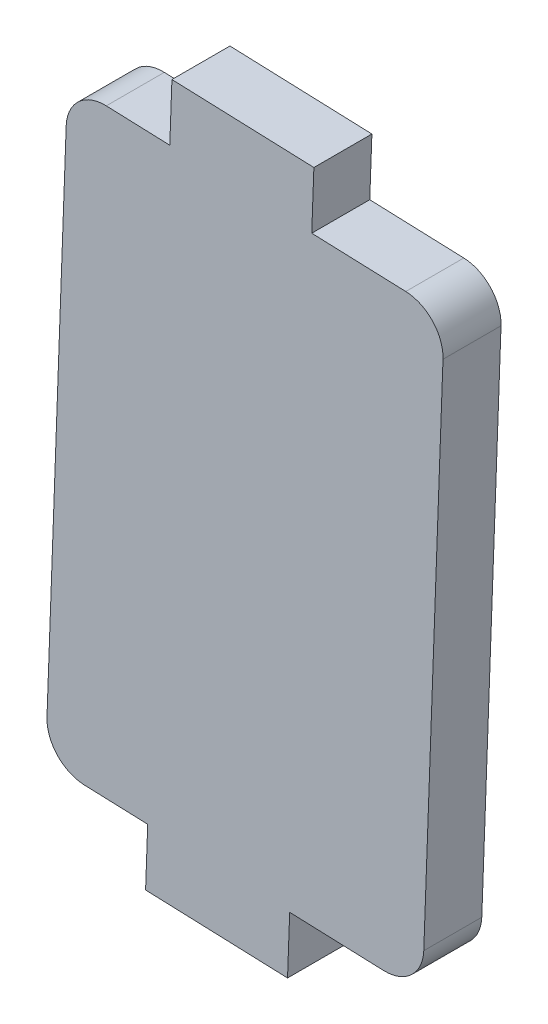
ISO-10303-21;
HEADER;
FILE_DESCRIPTION(('STEP AP214'),'2;1');
FILE_NAME('part.step','',(''),(''),'','','');
FILE_SCHEMA(('AUTOMOTIVE_DESIGN { 1 0 10303 214 1 1 1 1 }'));
ENDSEC;
DATA;
#1=APPLICATION_CONTEXT('core data for automotive mechanical design processes');
#2=APPLICATION_PROTOCOL_DEFINITION('international standard','automotive_design',2000,#1);
#3=PRODUCT_CONTEXT('',#1,'mechanical');
#4=PRODUCT('Part','Part','',(#3));
#5=PRODUCT_RELATED_PRODUCT_CATEGORY('part','',(#4));
#6=PRODUCT_DEFINITION_FORMATION('','',#4);
#7=PRODUCT_DEFINITION_CONTEXT('part definition',#1,'design');
#8=PRODUCT_DEFINITION('design','',#6,#7);
#9=PRODUCT_DEFINITION_SHAPE('','',#8);
#10=(LENGTH_UNIT() NAMED_UNIT(*) SI_UNIT(.MILLI.,.METRE.));
#11=(NAMED_UNIT(*) PLANE_ANGLE_UNIT() SI_UNIT($,.RADIAN.));
#12=(NAMED_UNIT(*) SI_UNIT($,.STERADIAN.) SOLID_ANGLE_UNIT());
#13=UNCERTAINTY_MEASURE_WITH_UNIT(LENGTH_MEASURE(1.E-05),#10,'distance_accuracy_value','');
#14=(GEOMETRIC_REPRESENTATION_CONTEXT(3) GLOBAL_UNCERTAINTY_ASSIGNED_CONTEXT((#13)) GLOBAL_UNIT_ASSIGNED_CONTEXT((#10,
#11,#12)) REPRESENTATION_CONTEXT('',''));
#15=CARTESIAN_POINT('',(0.,0.,0.));
#16=DIRECTION('',(0.,0.,1.));
#17=DIRECTION('',(1.,0.,0.));
#18=AXIS2_PLACEMENT_3D('',#15,#16,#17);
#19=CARTESIAN_POINT('',(708.902436994534,484.37191480293,3.00000000000002));
#20=DIRECTION('',(0.0368075614884528,0.999322372118865,0.));
#21=DIRECTION('',(-0.999322372118865,0.0368075614884533,0.));
#22=AXIS2_PLACEMENT_3D('',#19,#20,#21);
#23=PLANE('',#22);
#24=DIRECTION('',(0.999322372118865,-0.0368075614884534,0.));
#25=VECTOR('',#24,1.);
#26=CARTESIAN_POINT('',(708.902436994534,484.37191480293,0.));
#27=LINE('',#26,#25);
#28=CARTESIAN_POINT('',(701.562436994534,484.642265501426,0.));
#29=VERTEX_POINT('',#28);
#30=CARTESIAN_POINT('',(708.902436994534,484.37191480293,0.));
#31=VERTEX_POINT('',#30);
#32=EDGE_CURVE('E148',#29,#31,#27,.T.);
#33=ORIENTED_EDGE('',*,*,#32,.T.);
#34=DIRECTION('',(0.,0.,-1.));
#35=VECTOR('',#34,1.);
#36=CARTESIAN_POINT('',(708.902436994534,484.37191480293,3.00000000000002));
#37=LINE('',#36,#35);
#38=CARTESIAN_POINT('',(708.902436994534,484.37191480293,3.00000000000002));
#39=VERTEX_POINT('',#38);
#40=EDGE_CURVE('E11',#39,#31,#37,.T.);
#41=ORIENTED_EDGE('',*,*,#40,.F.);
#42=DIRECTION('',(0.999322372118865,-0.0368075614884534,0.));
#43=VECTOR('',#42,1.);
#44=CARTESIAN_POINT('',(708.902436994534,484.37191480293,3.00000000000002));
#45=LINE('',#44,#43);
#46=CARTESIAN_POINT('',(701.562436994534,484.642265501426,3.));
#47=VERTEX_POINT('',#46);
#48=EDGE_CURVE('E191',#47,#39,#45,.T.);
#49=ORIENTED_EDGE('',*,*,#48,.F.);
#50=DIRECTION('',(0.,0.,-1.));
#51=VECTOR('',#50,1.);
#52=CARTESIAN_POINT('',(701.562436994534,484.642265501426,3.));
#53=LINE('',#52,#51);
#54=EDGE_CURVE('E161',#47,#29,#53,.T.);
#55=ORIENTED_EDGE('',*,*,#54,.T.);
#56=EDGE_LOOP('',(#33,#41,#49,#55));
#57=FACE_BOUND('',#56,.T.);
#58=ADVANCED_FACE('F32',(#57),#23,.F.);
#59=CARTESIAN_POINT('',(708.902436994534,484.37191480293,3.00000000000002));
#60=DIRECTION('',(-0.999322372118865,0.0368075614884591,0.));
#61=DIRECTION('',(-0.0368075614884588,-0.999322372118864,0.));
#62=AXIS2_PLACEMENT_3D('',#59,#60,#61);
#63=PLANE('',#62);
#64=DIRECTION('',(0.0368075614884587,0.999322372118864,0.));
#65=VECTOR('',#64,1.);
#66=CARTESIAN_POINT('',(708.902436994534,484.37191480293,0.));
#67=LINE('',#66,#65);
#68=CARTESIAN_POINT('',(709.012859679,487.369881919287,0.));
#69=VERTEX_POINT('',#68);
#70=EDGE_CURVE('E144',#31,#69,#67,.T.);
#71=ORIENTED_EDGE('',*,*,#70,.T.);
#72=DIRECTION('',(0.,0.,-1.));
#73=VECTOR('',#72,1.);
#74=CARTESIAN_POINT('',(709.012859679,487.369881919287,3.00000000000004));
#75=LINE('',#74,#73);
#76=CARTESIAN_POINT('',(709.012859679,487.369881919287,3.00000000000004));
#77=VERTEX_POINT('',#76);
#78=EDGE_CURVE('E39',#77,#69,#75,.T.);
#79=ORIENTED_EDGE('',*,*,#78,.F.);
#80=DIRECTION('',(0.0368075614884587,0.999322372118864,0.));
#81=VECTOR('',#80,1.);
#82=CARTESIAN_POINT('',(708.902436994534,484.37191480293,3.00000000000002));
#83=LINE('',#82,#81);
#84=EDGE_CURVE('E157',#39,#77,#83,.T.);
#85=ORIENTED_EDGE('',*,*,#84,.F.);
#86=ORIENTED_EDGE('',*,*,#40,.T.);
#87=EDGE_LOOP('',(#71,#79,#85,#86));
#88=FACE_BOUND('',#87,.T.);
#89=ADVANCED_FACE('F156',(#88),#63,.F.);
#90=CARTESIAN_POINT('',(713.874595705518,487.190811928732,2.99999999999999));
#91=DIRECTION('',(0.0368075614884165,0.999322372118866,0.));
#92=DIRECTION('',(-0.999322372118866,0.036807561488417,0.));
#93=AXIS2_PLACEMENT_3D('',#90,#91,#92);
#94=PLANE('',#93);
#95=DIRECTION('',(0.999322372118866,-0.0368075614884168,0.));
#96=VECTOR('',#95,1.);
#97=CARTESIAN_POINT('',(713.874595705518,487.190811928732,0.));
#98=LINE('',#97,#96);
#99=CARTESIAN_POINT('',(713.874595705518,487.190811928732,0.));
#100=VERTEX_POINT('',#99);
#101=EDGE_CURVE('E150',#69,#100,#98,.T.);
#102=ORIENTED_EDGE('',*,*,#101,.T.);
#103=DIRECTION('',(0.,0.,-1.));
#104=VECTOR('',#103,1.);
#105=CARTESIAN_POINT('',(713.874595705518,487.190811928732,2.99999999999999));
#106=LINE('',#105,#104);
#107=CARTESIAN_POINT('',(713.874595705518,487.190811928732,2.99999999999999));
#108=VERTEX_POINT('',#107);
#109=EDGE_CURVE('E257',#108,#100,#106,.T.);
#110=ORIENTED_EDGE('',*,*,#109,.F.);
#111=DIRECTION('',(0.999322372118866,-0.0368075614884168,0.));
#112=VECTOR('',#111,1.);
#113=CARTESIAN_POINT('',(713.874595705518,487.190811928732,2.99999999999999));
#114=LINE('',#113,#112);
#115=EDGE_CURVE('E194',#77,#108,#114,.T.);
#116=ORIENTED_EDGE('',*,*,#115,.F.);
#117=ORIENTED_EDGE('',*,*,#78,.T.);
#118=EDGE_LOOP('',(#102,#110,#116,#117));
#119=FACE_BOUND('',#118,.T.);
#120=ADVANCED_FACE('F261',(#119),#94,.F.);
#121=CARTESIAN_POINT('',(713.948210828495,489.189456672969,2.99999999999999));
#122=DIRECTION('',(0.,0.,-1.));
#123=DIRECTION('',(-1.,0.,0.));
#124=AXIS2_PLACEMENT_3D('',#121,#122,#123);
#125=CYLINDRICAL_SURFACE('',#124,1.99999999999999);
#126=CARTESIAN_POINT('',(713.948210828495,489.189456672969,0.));
#127=DIRECTION('',(0.,0.,1.));
#128=DIRECTION('',(-1.,0.,0.));
#129=AXIS2_PLACEMENT_3D('',#126,#127,#128);
#130=CIRCLE('',#129,1.99999999999999);
#131=CARTESIAN_POINT('',(715.946855572732,489.115841549992,0.));
#132=VERTEX_POINT('',#131);
#133=EDGE_CURVE('E165',#100,#132,#130,.T.);
#134=ORIENTED_EDGE('',*,*,#133,.T.);
#135=DIRECTION('',(0.,0.,-1.));
#136=VECTOR('',#135,1.);
#137=CARTESIAN_POINT('',(715.946855572732,489.115841549992,2.99999999999996));
#138=LINE('',#137,#136);
#139=CARTESIAN_POINT('',(715.946855572732,489.115841549992,2.99999999999996));
#140=VERTEX_POINT('',#139);
#141=EDGE_CURVE('E254',#140,#132,#138,.T.);
#142=ORIENTED_EDGE('',*,*,#141,.F.);
#143=CARTESIAN_POINT('',(713.948210828495,489.189456672969,2.99999999999999));
#144=DIRECTION('',(0.,0.,1.));
#145=DIRECTION('',(-1.,0.,0.));
#146=AXIS2_PLACEMENT_3D('',#143,#144,#145);
#147=CIRCLE('',#146,1.99999999999999);
#148=EDGE_CURVE('E196',#108,#140,#147,.T.);
#149=ORIENTED_EDGE('',*,*,#148,.F.);
#150=ORIENTED_EDGE('',*,*,#109,.T.);
#151=EDGE_LOOP('',(#134,#142,#149,#150));
#152=FACE_BOUND('',#151,.T.);
#153=ADVANCED_FACE('F269',(#152),#125,.T.);
#154=CARTESIAN_POINT('',(716.94065973292,516.097545597202,2.99999999999988));
#155=DIRECTION('',(-0.999322372118865,0.0368075614884487,0.));
#156=DIRECTION('',(-0.0368075614884485,-0.999322372118865,0.));
#157=AXIS2_PLACEMENT_3D('',#154,#155,#156);
#158=PLANE('',#157);
#159=DIRECTION('',(0.0368075614884484,0.999322372118865,0.));
#160=VECTOR('',#159,1.);
#161=CARTESIAN_POINT('',(716.94065973292,516.097545597202,0.));
#162=LINE('',#161,#160);
#163=CARTESIAN_POINT('',(716.94065973292,516.097545597202,0.));
#164=VERTEX_POINT('',#163);
#165=EDGE_CURVE('E167',#132,#164,#162,.T.);
#166=ORIENTED_EDGE('',*,*,#165,.T.);
#167=DIRECTION('',(0.,0.,-1.));
#168=VECTOR('',#167,1.);
#169=CARTESIAN_POINT('',(716.94065973292,516.097545597202,2.99999999999988));
#170=LINE('',#169,#168);
#171=CARTESIAN_POINT('',(716.94065973292,516.097545597202,2.99999999999988));
#172=VERTEX_POINT('',#171);
#173=EDGE_CURVE('E251',#172,#164,#170,.T.);
#174=ORIENTED_EDGE('',*,*,#173,.F.);
#175=DIRECTION('',(0.0368075614884484,0.999322372118865,0.));
#176=VECTOR('',#175,1.);
#177=CARTESIAN_POINT('',(716.94065973292,516.097545597202,2.99999999999988));
#178=LINE('',#177,#176);
#179=EDGE_CURVE('E198',#140,#172,#178,.T.);
#180=ORIENTED_EDGE('',*,*,#179,.F.);
#181=ORIENTED_EDGE('',*,*,#141,.T.);
#182=EDGE_LOOP('',(#166,#174,#180,#181));
#183=FACE_BOUND('',#182,.T.);
#184=ADVANCED_FACE('F272',(#183),#158,.F.);
#185=CARTESIAN_POINT('',(714.942014988683,516.171160720179,2.99999999999995));
#186=DIRECTION('',(0.,0.,-1.));
#187=DIRECTION('',(-1.,0.,0.));
#188=AXIS2_PLACEMENT_3D('',#185,#186,#187);
#189=CYLINDRICAL_SURFACE('',#188,1.9999999999996);
#190=CARTESIAN_POINT('',(714.942014988683,516.171160720179,0.));
#191=DIRECTION('',(0.,0.,1.));
#192=DIRECTION('',(1.,0.,0.));
#193=AXIS2_PLACEMENT_3D('',#190,#191,#192);
#194=CIRCLE('',#193,1.9999999999996);
#195=CARTESIAN_POINT('',(715.01563011166,518.169805464417,0.));
#196=VERTEX_POINT('',#195);
#197=EDGE_CURVE('E169',#164,#196,#194,.T.);
#198=ORIENTED_EDGE('',*,*,#197,.T.);
#199=DIRECTION('',(0.,0.,-1.));
#200=VECTOR('',#199,1.);
#201=CARTESIAN_POINT('',(715.01563011166,518.169805464417,2.99999999999993));
#202=LINE('',#201,#200);
#203=CARTESIAN_POINT('',(715.01563011166,518.169805464417,2.99999999999993));
#204=VERTEX_POINT('',#203);
#205=EDGE_CURVE('E248',#204,#196,#202,.T.);
#206=ORIENTED_EDGE('',*,*,#205,.F.);
#207=CARTESIAN_POINT('',(714.942014988683,516.171160720179,2.99999999999995));
#208=DIRECTION('',(0.,0.,1.));
#209=DIRECTION('',(1.,0.,0.));
#210=AXIS2_PLACEMENT_3D('',#207,#208,#209);
#211=CIRCLE('',#210,1.9999999999996);
#212=EDGE_CURVE('E200',#172,#204,#211,.T.);
#213=ORIENTED_EDGE('',*,*,#212,.F.);
#214=ORIENTED_EDGE('',*,*,#173,.T.);
#215=EDGE_LOOP('',(#198,#206,#213,#214));
#216=FACE_BOUND('',#215,.T.);
#217=ADVANCED_FACE('F277',(#216),#189,.T.);
#218=CARTESIAN_POINT('',(715.01563011166,518.169805464417,2.99999999999993));
#219=DIRECTION('',(-0.0368075614884507,-0.999322372118864,0.));
#220=DIRECTION('',(0.999322372118865,-0.0368075614884513,0.));
#221=AXIS2_PLACEMENT_3D('',#218,#219,#220);
#222=PLANE('',#221);
#223=DIRECTION('',(-0.999322372118865,0.0368075614884512,0.));
#224=VECTOR('',#223,1.);
#225=CARTESIAN_POINT('',(715.01563011166,518.169805464417,0.));
#226=LINE('',#225,#224);
#227=CARTESIAN_POINT('',(710.153894085142,518.348875454971,0.));
#228=VERTEX_POINT('',#227);
#229=EDGE_CURVE('E171',#196,#228,#226,.T.);
#230=ORIENTED_EDGE('',*,*,#229,.T.);
#231=DIRECTION('',(0.,0.,-1.));
#232=VECTOR('',#231,1.);
#233=CARTESIAN_POINT('',(710.153894085142,518.348875454971,2.99999999999995));
#234=LINE('',#233,#232);
#235=CARTESIAN_POINT('',(710.153894085142,518.348875454971,2.99999999999995));
#236=VERTEX_POINT('',#235);
#237=EDGE_CURVE('E245',#236,#228,#234,.T.);
#238=ORIENTED_EDGE('',*,*,#237,.F.);
#239=DIRECTION('',(-0.999322372118865,0.0368075614884512,0.));
#240=VECTOR('',#239,1.);
#241=CARTESIAN_POINT('',(715.01563011166,518.169805464417,2.99999999999993));
#242=LINE('',#241,#240);
#243=EDGE_CURVE('E202',#204,#236,#242,.T.);
#244=ORIENTED_EDGE('',*,*,#243,.F.);
#245=ORIENTED_EDGE('',*,*,#205,.T.);
#246=EDGE_LOOP('',(#230,#238,#244,#245));
#247=FACE_BOUND('',#246,.T.);
#248=ADVANCED_FACE('F283',(#247),#222,.F.);
#249=CARTESIAN_POINT('',(710.153894085142,518.348875454971,2.99999999999995));
#250=DIRECTION('',(-0.999322372118865,0.0368075614884591,0.));
#251=DIRECTION('',(-0.0368075614884588,-0.999322372118864,0.));
#252=AXIS2_PLACEMENT_3D('',#249,#250,#251);
#253=PLANE('',#252);
#254=DIRECTION('',(0.0368075614884587,0.999322372118864,0.));
#255=VECTOR('',#254,1.);
#256=CARTESIAN_POINT('',(710.153894085142,518.348875454971,0.));
#257=LINE('',#256,#255);
#258=CARTESIAN_POINT('',(710.264316769607,521.346842571328,0.));
#259=VERTEX_POINT('',#258);
#260=EDGE_CURVE('E173',#228,#259,#257,.T.);
#261=ORIENTED_EDGE('',*,*,#260,.T.);
#262=DIRECTION('',(0.,0.,-1.));
#263=VECTOR('',#262,1.);
#264=CARTESIAN_POINT('',(710.264316769607,521.346842571328,2.99999999999993));
#265=LINE('',#264,#263);
#266=CARTESIAN_POINT('',(710.264316769607,521.346842571328,2.99999999999993));
#267=VERTEX_POINT('',#266);
#268=EDGE_CURVE('E242',#267,#259,#265,.T.);
#269=ORIENTED_EDGE('',*,*,#268,.F.);
#270=DIRECTION('',(0.0368075614884587,0.999322372118864,0.));
#271=VECTOR('',#270,1.);
#272=CARTESIAN_POINT('',(710.153894085142,518.348875454971,2.99999999999995));
#273=LINE('',#272,#271);
#274=EDGE_CURVE('E204',#236,#267,#273,.T.);
#275=ORIENTED_EDGE('',*,*,#274,.F.);
#276=ORIENTED_EDGE('',*,*,#237,.T.);
#277=EDGE_LOOP('',(#261,#269,#275,#276));
#278=FACE_BOUND('',#277,.T.);
#279=ADVANCED_FACE('F287',(#278),#253,.F.);
#280=CARTESIAN_POINT('',(710.264316769607,521.346842571328,2.99999999999993));
#281=DIRECTION('',(-0.0368075614884536,-0.999322372118864,0.));
#282=DIRECTION('',(0.999322372118865,-0.0368075614884539,0.));
#283=AXIS2_PLACEMENT_3D('',#280,#281,#282);
#284=PLANE('',#283);
#285=DIRECTION('',(-0.999322372118865,0.0368075614884539,0.));
#286=VECTOR('',#285,1.);
#287=CARTESIAN_POINT('',(710.264316769607,521.346842571328,0.));
#288=LINE('',#287,#286);
#289=CARTESIAN_POINT('',(702.924316769607,521.617193269824,0.));
#290=VERTEX_POINT('',#289);
#291=EDGE_CURVE('E175',#259,#290,#288,.T.);
#292=ORIENTED_EDGE('',*,*,#291,.T.);
#293=DIRECTION('',(0.,0.,-1.));
#294=VECTOR('',#293,1.);
#295=CARTESIAN_POINT('',(702.924316769607,521.617193269824,2.99999999999996));
#296=LINE('',#295,#294);
#297=CARTESIAN_POINT('',(702.924316769607,521.617193269824,2.99999999999996));
#298=VERTEX_POINT('',#297);
#299=EDGE_CURVE('E239',#298,#290,#296,.T.);
#300=ORIENTED_EDGE('',*,*,#299,.F.);
#301=DIRECTION('',(-0.999322372118865,0.0368075614884539,0.));
#302=VECTOR('',#301,1.);
#303=CARTESIAN_POINT('',(710.264316769607,521.346842571328,2.99999999999993));
#304=LINE('',#303,#302);
#305=EDGE_CURVE('E206',#267,#298,#304,.T.);
#306=ORIENTED_EDGE('',*,*,#305,.F.);
#307=ORIENTED_EDGE('',*,*,#268,.T.);
#308=EDGE_LOOP('',(#292,#300,#306,#307));
#309=FACE_BOUND('',#308,.T.);
#310=ADVANCED_FACE('F292',(#309),#284,.F.);
#311=CARTESIAN_POINT('',(702.813894085142,518.619226153468,3.00000000000006));
#312=DIRECTION('',(0.999322372118865,-0.0368075614884591,0.));
#313=DIRECTION('',(0.0368075614884588,0.999322372118864,0.));
#314=AXIS2_PLACEMENT_3D('',#311,#312,#313);
#315=PLANE('',#314);
#316=DIRECTION('',(-0.0368075614884587,-0.999322372118864,0.));
#317=VECTOR('',#316,1.);
#318=CARTESIAN_POINT('',(702.813894085142,518.619226153468,0.));
#319=LINE('',#318,#317);
#320=CARTESIAN_POINT('',(702.813894085142,518.619226153468,0.));
#321=VERTEX_POINT('',#320);
#322=EDGE_CURVE('E177',#290,#321,#319,.T.);
#323=ORIENTED_EDGE('',*,*,#322,.T.);
#324=DIRECTION('',(0.,0.,-1.));
#325=VECTOR('',#324,1.);
#326=CARTESIAN_POINT('',(702.813894085142,518.619226153468,3.00000000000006));
#327=LINE('',#326,#325);
#328=CARTESIAN_POINT('',(702.813894085142,518.619226153468,3.00000000000006));
#329=VERTEX_POINT('',#328);
#330=EDGE_CURVE('E236',#329,#321,#327,.T.);
#331=ORIENTED_EDGE('',*,*,#330,.F.);
#332=DIRECTION('',(-0.0368075614884587,-0.999322372118864,0.));
#333=VECTOR('',#332,1.);
#334=CARTESIAN_POINT('',(702.813894085142,518.619226153468,3.00000000000006));
#335=LINE('',#334,#333);
#336=EDGE_CURVE('E208',#298,#329,#335,.T.);
#337=ORIENTED_EDGE('',*,*,#336,.F.);
#338=ORIENTED_EDGE('',*,*,#299,.T.);
#339=EDGE_LOOP('',(#323,#331,#337,#338));
#340=FACE_BOUND('',#339,.T.);
#341=ADVANCED_FACE('F298',(#340),#315,.F.);
#342=CARTESIAN_POINT('',(702.813894085142,518.619226153468,3.00000000000006));
#343=DIRECTION('',(-0.036807561488416,-0.999322372118866,0.));
#344=DIRECTION('',(0.999322372118866,-0.0368075614884164,0.));
#345=AXIS2_PLACEMENT_3D('',#342,#343,#344);
#346=PLANE('',#345);
#347=DIRECTION('',(-0.999322372118866,0.0368075614884162,0.));
#348=VECTOR('',#347,1.);
#349=CARTESIAN_POINT('',(702.813894085142,518.619226153468,0.));
#350=LINE('',#349,#348);
#351=CARTESIAN_POINT('',(699.53031576578,518.740168618346,0.));
#352=VERTEX_POINT('',#351);
#353=EDGE_CURVE('E179',#321,#352,#350,.T.);
#354=ORIENTED_EDGE('',*,*,#353,.T.);
#355=DIRECTION('',(0.,0.,-1.));
#356=VECTOR('',#355,1.);
#357=CARTESIAN_POINT('',(699.53031576578,518.740168618346,3.));
#358=LINE('',#357,#356);
#359=CARTESIAN_POINT('',(699.53031576578,518.740168618346,3.));
#360=VERTEX_POINT('',#359);
#361=EDGE_CURVE('E233',#360,#352,#358,.T.);
#362=ORIENTED_EDGE('',*,*,#361,.F.);
#363=DIRECTION('',(-0.999322372118866,0.0368075614884162,0.));
#364=VECTOR('',#363,1.);
#365=CARTESIAN_POINT('',(702.813894085142,518.619226153468,3.00000000000006));
#366=LINE('',#365,#364);
#367=EDGE_CURVE('E210',#329,#360,#366,.T.);
#368=ORIENTED_EDGE('',*,*,#367,.F.);
#369=ORIENTED_EDGE('',*,*,#330,.T.);
#370=EDGE_LOOP('',(#354,#362,#368,#369));
#371=FACE_BOUND('',#370,.T.);
#372=ADVANCED_FACE('F302',(#371),#346,.F.);
#373=CARTESIAN_POINT('',(699.456700642804,516.741523874109,2.99999999999996));
#374=DIRECTION('',(0.,0.,-1.));
#375=DIRECTION('',(-1.,0.,0.));
#376=AXIS2_PLACEMENT_3D('',#373,#374,#375);
#377=CYLINDRICAL_SURFACE('',#376,1.99999999999993);
#378=CARTESIAN_POINT('',(699.456700642803,516.741523874108,0.));
#379=DIRECTION('',(0.,0.,1.));
#380=DIRECTION('',(-1.,0.,0.));
#381=AXIS2_PLACEMENT_3D('',#378,#379,#380);
#382=CIRCLE('',#381,1.99999999999993);
#383=CARTESIAN_POINT('',(697.458055898565,516.815138997085,0.));
#384=VERTEX_POINT('',#383);
#385=EDGE_CURVE('E181',#352,#384,#382,.T.);
#386=ORIENTED_EDGE('',*,*,#385,.T.);
#387=DIRECTION('',(0.,0.,-1.));
#388=VECTOR('',#387,1.);
#389=CARTESIAN_POINT('',(697.458055898565,516.815138997085,2.99999999999995));
#390=LINE('',#389,#388);
#391=CARTESIAN_POINT('',(697.458055898565,516.815138997085,2.99999999999995));
#392=VERTEX_POINT('',#391);
#393=EDGE_CURVE('E230',#392,#384,#390,.T.);
#394=ORIENTED_EDGE('',*,*,#393,.F.);
#395=CARTESIAN_POINT('',(699.456700642804,516.741523874109,2.99999999999996));
#396=DIRECTION('',(0.,0.,1.));
#397=DIRECTION('',(-1.,0.,0.));
#398=AXIS2_PLACEMENT_3D('',#395,#396,#397);
#399=CIRCLE('',#398,1.99999999999993);
#400=EDGE_CURVE('E212',#360,#392,#399,.T.);
#401=ORIENTED_EDGE('',*,*,#400,.F.);
#402=ORIENTED_EDGE('',*,*,#361,.T.);
#403=EDGE_LOOP('',(#386,#394,#401,#402));
#404=FACE_BOUND('',#403,.T.);
#405=ADVANCED_FACE('F307',(#404),#377,.T.);
#406=CARTESIAN_POINT('',(697.458055898565,516.815138997085,2.99999999999995));
#407=DIRECTION('',(0.999322372118865,-0.0368075614884534,0.));
#408=DIRECTION('',(0.0368075614884528,0.999322372118865,0.));
#409=AXIS2_PLACEMENT_3D('',#406,#407,#408);
#410=PLANE('',#409);
#411=DIRECTION('',(-0.0368075614884528,-0.999322372118865,0.));
#412=VECTOR('',#411,1.);
#413=CARTESIAN_POINT('',(697.458055898565,516.815138997085,0.));
#414=LINE('',#413,#412);
#415=CARTESIAN_POINT('',(696.464251738377,489.833434949876,0.));
#416=VERTEX_POINT('',#415);
#417=EDGE_CURVE('E183',#384,#416,#414,.T.);
#418=ORIENTED_EDGE('',*,*,#417,.T.);
#419=DIRECTION('',(0.,0.,-1.));
#420=VECTOR('',#419,1.);
#421=CARTESIAN_POINT('',(696.464251738377,489.833434949876,2.99999999999993));
#422=LINE('',#421,#420);
#423=CARTESIAN_POINT('',(696.464251738377,489.833434949876,2.99999999999993));
#424=VERTEX_POINT('',#423);
#425=EDGE_CURVE('E227',#424,#416,#422,.T.);
#426=ORIENTED_EDGE('',*,*,#425,.F.);
#427=DIRECTION('',(-0.0368075614884528,-0.999322372118865,0.));
#428=VECTOR('',#427,1.);
#429=CARTESIAN_POINT('',(697.458055898565,516.815138997085,2.99999999999995));
#430=LINE('',#429,#428);
#431=EDGE_CURVE('E214',#392,#424,#430,.T.);
#432=ORIENTED_EDGE('',*,*,#431,.F.);
#433=ORIENTED_EDGE('',*,*,#393,.T.);
#434=EDGE_LOOP('',(#418,#426,#432,#433));
#435=FACE_BOUND('',#434,.T.);
#436=ADVANCED_FACE('F313',(#435),#410,.F.);
#437=CARTESIAN_POINT('',(698.462896482615,489.759819826899,2.99999999999996));
#438=DIRECTION('',(0.,0.,-1.));
#439=DIRECTION('',(-1.,0.,0.));
#440=AXIS2_PLACEMENT_3D('',#437,#438,#439);
#441=CYLINDRICAL_SURFACE('',#440,2.00000000000005);
#442=CARTESIAN_POINT('',(698.462896482615,489.759819826899,0.));
#443=DIRECTION('',(0.,0.,1.));
#444=DIRECTION('',(1.,0.,0.));
#445=AXIS2_PLACEMENT_3D('',#442,#443,#444);
#446=CIRCLE('',#445,2.00000000000005);
#447=CARTESIAN_POINT('',(698.389281359638,487.761175082661,0.));
#448=VERTEX_POINT('',#447);
#449=EDGE_CURVE('E185',#416,#448,#446,.T.);
#450=ORIENTED_EDGE('',*,*,#449,.T.);
#451=DIRECTION('',(0.,0.,-1.));
#452=VECTOR('',#451,1.);
#453=CARTESIAN_POINT('',(698.389281359638,487.761175082661,2.99999999999999));
#454=LINE('',#453,#452);
#455=CARTESIAN_POINT('',(698.389281359638,487.761175082661,2.99999999999999));
#456=VERTEX_POINT('',#455);
#457=EDGE_CURVE('E224',#456,#448,#454,.T.);
#458=ORIENTED_EDGE('',*,*,#457,.F.);
#459=CARTESIAN_POINT('',(698.462896482615,489.759819826899,2.99999999999996));
#460=DIRECTION('',(0.,0.,1.));
#461=DIRECTION('',(1.,0.,0.));
#462=AXIS2_PLACEMENT_3D('',#459,#460,#461);
#463=CIRCLE('',#462,2.00000000000005);
#464=EDGE_CURVE('E216',#424,#456,#463,.T.);
#465=ORIENTED_EDGE('',*,*,#464,.F.);
#466=ORIENTED_EDGE('',*,*,#425,.T.);
#467=EDGE_LOOP('',(#450,#458,#465,#466));
#468=FACE_BOUND('',#467,.T.);
#469=ADVANCED_FACE('F317',(#468),#441,.T.);
#470=CARTESIAN_POINT('',(701.672859679,487.640232617783,2.99999999999996));
#471=DIRECTION('',(0.0368075614884497,0.999322372118864,0.));
#472=DIRECTION('',(-0.999322372118865,0.0368075614884502,0.));
#473=AXIS2_PLACEMENT_3D('',#470,#471,#472);
#474=PLANE('',#473);
#475=DIRECTION('',(0.999322372118865,-0.03680756148845,0.));
#476=VECTOR('',#475,1.);
#477=CARTESIAN_POINT('',(701.672859679,487.640232617783,0.));
#478=LINE('',#477,#476);
#479=CARTESIAN_POINT('',(701.672859679,487.640232617783,0.));
#480=VERTEX_POINT('',#479);
#481=EDGE_CURVE('E187',#448,#480,#478,.T.);
#482=ORIENTED_EDGE('',*,*,#481,.T.);
#483=DIRECTION('',(0.,0.,-1.));
#484=VECTOR('',#483,1.);
#485=CARTESIAN_POINT('',(701.672859679,487.640232617783,2.99999999999996));
#486=LINE('',#485,#484);
#487=CARTESIAN_POINT('',(701.672859679,487.640232617783,2.99999999999996));
#488=VERTEX_POINT('',#487);
#489=EDGE_CURVE('E221',#488,#480,#486,.T.);
#490=ORIENTED_EDGE('',*,*,#489,.F.);
#491=DIRECTION('',(0.999322372118865,-0.03680756148845,0.));
#492=VECTOR('',#491,1.);
#493=CARTESIAN_POINT('',(701.672859679,487.640232617783,2.99999999999996));
#494=LINE('',#493,#492);
#495=EDGE_CURVE('E51',#456,#488,#494,.T.);
#496=ORIENTED_EDGE('',*,*,#495,.F.);
#497=ORIENTED_EDGE('',*,*,#457,.T.);
#498=EDGE_LOOP('',(#482,#490,#496,#497));
#499=FACE_BOUND('',#498,.T.);
#500=ADVANCED_FACE('F320',(#499),#474,.F.);
#501=CARTESIAN_POINT('',(701.562436994534,484.642265501426,3.));
#502=DIRECTION('',(0.999322372118865,-0.036807561488457,0.));
#503=DIRECTION('',(0.0368075614884567,0.999322372118865,0.));
#504=AXIS2_PLACEMENT_3D('',#501,#502,#503);
#505=PLANE('',#504);
#506=DIRECTION('',(-0.0368075614884568,-0.999322372118864,0.));
#507=VECTOR('',#506,1.);
#508=CARTESIAN_POINT('',(701.562436994534,484.642265501426,0.));
#509=LINE('',#508,#507);
#510=EDGE_CURVE('E189',#480,#29,#509,.T.);
#511=ORIENTED_EDGE('',*,*,#510,.T.);
#512=ORIENTED_EDGE('',*,*,#54,.F.);
#513=DIRECTION('',(-0.0368075614884568,-0.999322372118864,0.));
#514=VECTOR('',#513,1.);
#515=CARTESIAN_POINT('',(701.562436994534,484.642265501426,3.));
#516=LINE('',#515,#514);
#517=EDGE_CURVE('E46',#488,#47,#516,.T.);
#518=ORIENTED_EDGE('',*,*,#517,.F.);
#519=ORIENTED_EDGE('',*,*,#489,.T.);
#520=EDGE_LOOP('',(#511,#512,#518,#519));
#521=FACE_BOUND('',#520,.T.);
#522=ADVANCED_FACE('F322',(#521),#505,.F.);
#523=CARTESIAN_POINT('',(698.462896482615,489.759819826899,2.99999999999996));
#524=DIRECTION('',(0.,0.,1.));
#525=DIRECTION('',(1.,0.,0.));
#526=AXIS2_PLACEMENT_3D('',#523,#524,#525);
#527=PLANE('',#526);
#528=ORIENTED_EDGE('',*,*,#48,.T.);
#529=ORIENTED_EDGE('',*,*,#84,.T.);
#530=ORIENTED_EDGE('',*,*,#115,.T.);
#531=ORIENTED_EDGE('',*,*,#148,.T.);
#532=ORIENTED_EDGE('',*,*,#179,.T.);
#533=ORIENTED_EDGE('',*,*,#212,.T.);
#534=ORIENTED_EDGE('',*,*,#243,.T.);
#535=ORIENTED_EDGE('',*,*,#274,.T.);
#536=ORIENTED_EDGE('',*,*,#305,.T.);
#537=ORIENTED_EDGE('',*,*,#336,.T.);
#538=ORIENTED_EDGE('',*,*,#367,.T.);
#539=ORIENTED_EDGE('',*,*,#400,.T.);
#540=ORIENTED_EDGE('',*,*,#431,.T.);
#541=ORIENTED_EDGE('',*,*,#464,.T.);
#542=ORIENTED_EDGE('',*,*,#495,.T.);
#543=ORIENTED_EDGE('',*,*,#517,.T.);
#544=EDGE_LOOP('',(#528,#529,#530,#531,#532,#533,#534,#535,#536,#537,#538,#539,#540,#541,#542,#543));
#545=FACE_BOUND('',#544,.T.);
#546=ADVANCED_FACE('F264',(#545),#527,.T.);
#547=CARTESIAN_POINT('',(698.462896482615,489.759819826899,0.));
#548=DIRECTION('',(0.,0.,1.));
#549=DIRECTION('',(1.,0.,0.));
#550=AXIS2_PLACEMENT_3D('',#547,#548,#549);
#551=PLANE('',#550);
#552=ORIENTED_EDGE('',*,*,#32,.F.);
#553=ORIENTED_EDGE('',*,*,#510,.F.);
#554=ORIENTED_EDGE('',*,*,#481,.F.);
#555=ORIENTED_EDGE('',*,*,#449,.F.);
#556=ORIENTED_EDGE('',*,*,#417,.F.);
#557=ORIENTED_EDGE('',*,*,#385,.F.);
#558=ORIENTED_EDGE('',*,*,#353,.F.);
#559=ORIENTED_EDGE('',*,*,#322,.F.);
#560=ORIENTED_EDGE('',*,*,#291,.F.);
#561=ORIENTED_EDGE('',*,*,#260,.F.);
#562=ORIENTED_EDGE('',*,*,#229,.F.);
#563=ORIENTED_EDGE('',*,*,#197,.F.);
#564=ORIENTED_EDGE('',*,*,#165,.F.);
#565=ORIENTED_EDGE('',*,*,#133,.F.);
#566=ORIENTED_EDGE('',*,*,#101,.F.);
#567=ORIENTED_EDGE('',*,*,#70,.F.);
#568=EDGE_LOOP('',(#552,#553,#554,#555,#556,#557,#558,#559,#560,#561,#562,#563,#564,#565,#566,#567));
#569=FACE_BOUND('',#568,.T.);
#570=ADVANCED_FACE('F145',(#569),#551,.F.);
#571=CLOSED_SHELL('',(#58,#89,#120,#153,#184,#217,#248,#279,#310,#341,#372,#405,#436,#469,#500,
#522,#546,#570));
#572=MANIFOLD_SOLID_BREP('B2',#571);
#573=ADVANCED_BREP_SHAPE_REPRESENTATION('',(#18,#572),#14);
#574=SHAPE_DEFINITION_REPRESENTATION(#9,#573);
ENDSEC;
END-ISO-10303-21;
